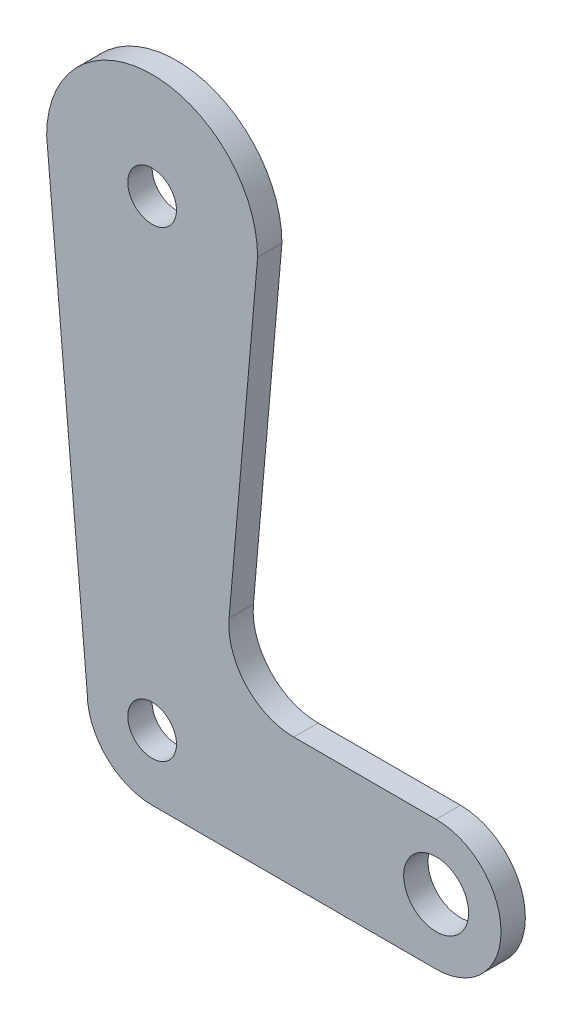
ISO-10303-21;
HEADER;
FILE_DESCRIPTION(('STEP AP214'),'2;1');
FILE_NAME('part.step','',(''),(''),'','','');
FILE_SCHEMA(('AUTOMOTIVE_DESIGN { 1 0 10303 214 1 1 1 1 }'));
ENDSEC;
DATA;
#1=APPLICATION_CONTEXT('core data for automotive mechanical design processes');
#2=APPLICATION_PROTOCOL_DEFINITION('international standard','automotive_design',2000,#1);
#3=PRODUCT_CONTEXT('',#1,'mechanical');
#4=PRODUCT('Part','Part','',(#3));
#5=PRODUCT_RELATED_PRODUCT_CATEGORY('part','',(#4));
#6=PRODUCT_DEFINITION_FORMATION('','',#4);
#7=PRODUCT_DEFINITION_CONTEXT('part definition',#1,'design');
#8=PRODUCT_DEFINITION('design','',#6,#7);
#9=PRODUCT_DEFINITION_SHAPE('','',#8);
#10=(LENGTH_UNIT() NAMED_UNIT(*) SI_UNIT(.MILLI.,.METRE.));
#11=(NAMED_UNIT(*) PLANE_ANGLE_UNIT() SI_UNIT($,.RADIAN.));
#12=(NAMED_UNIT(*) SI_UNIT($,.STERADIAN.) SOLID_ANGLE_UNIT());
#13=UNCERTAINTY_MEASURE_WITH_UNIT(LENGTH_MEASURE(1.E-05),#10,'distance_accuracy_value','');
#14=(GEOMETRIC_REPRESENTATION_CONTEXT(3) GLOBAL_UNCERTAINTY_ASSIGNED_CONTEXT((#13)) GLOBAL_UNIT_ASSIGNED_CONTEXT((#10,
#11,#12)) REPRESENTATION_CONTEXT('',''));
#15=CARTESIAN_POINT('',(0.,0.,0.));
#16=DIRECTION('',(0.,0.,1.));
#17=DIRECTION('',(1.,0.,0.));
#18=AXIS2_PLACEMENT_3D('',#15,#16,#17);
#19=CARTESIAN_POINT('',(35.,0.,-3.));
#20=DIRECTION('',(0.,0.,1.));
#21=DIRECTION('',(1.,0.,0.));
#22=AXIS2_PLACEMENT_3D('',#19,#20,#21);
#23=CYLINDRICAL_SURFACE('',#22,8.);
#24=CARTESIAN_POINT('',(35.,0.,0.));
#25=DIRECTION('',(0.,0.,1.));
#26=DIRECTION('',(1.,0.,0.));
#27=AXIS2_PLACEMENT_3D('',#24,#25,#26);
#28=CIRCLE('',#27,8.);
#29=CARTESIAN_POINT('',(35.,-8.,0.));
#30=VERTEX_POINT('',#29);
#31=CARTESIAN_POINT('',(35.,8.,0.));
#32=VERTEX_POINT('',#31);
#33=EDGE_CURVE('E135',#30,#32,#28,.T.);
#34=ORIENTED_EDGE('',*,*,#33,.F.);
#35=DIRECTION('',(0.,0.,1.));
#36=VECTOR('',#35,1.);
#37=CARTESIAN_POINT('',(35.,-8.,-3.));
#38=LINE('',#37,#36);
#39=CARTESIAN_POINT('',(35.,-8.,-3.));
#40=VERTEX_POINT('',#39);
#41=EDGE_CURVE('E11',#40,#30,#38,.T.);
#42=ORIENTED_EDGE('',*,*,#41,.F.);
#43=CARTESIAN_POINT('',(35.,0.,-3.));
#44=DIRECTION('',(0.,0.,1.));
#45=DIRECTION('',(1.,0.,0.));
#46=AXIS2_PLACEMENT_3D('',#43,#44,#45);
#47=CIRCLE('',#46,8.);
#48=CARTESIAN_POINT('',(35.,8.,-3.));
#49=VERTEX_POINT('',#48);
#50=EDGE_CURVE('E156',#40,#49,#47,.T.);
#51=ORIENTED_EDGE('',*,*,#50,.T.);
#52=DIRECTION('',(0.,0.,1.));
#53=VECTOR('',#52,1.);
#54=CARTESIAN_POINT('',(35.,8.,-3.));
#55=LINE('',#54,#53);
#56=EDGE_CURVE('E41',#49,#32,#55,.T.);
#57=ORIENTED_EDGE('',*,*,#56,.T.);
#58=EDGE_LOOP('',(#34,#42,#51,#57));
#59=FACE_BOUND('',#58,.T.);
#60=ADVANCED_FACE('F38',(#59),#23,.T.);
#61=CARTESIAN_POINT('',(35.,-8.,-3.));
#62=DIRECTION('',(0.,-1.,0.));
#63=DIRECTION('',(1.,0.,0.));
#64=AXIS2_PLACEMENT_3D('',#61,#62,#63);
#65=PLANE('',#64);
#66=DIRECTION('',(1.,0.,0.));
#67=VECTOR('',#66,1.);
#68=CARTESIAN_POINT('',(35.,-8.,0.));
#69=LINE('',#68,#67);
#70=CARTESIAN_POINT('',(0.,-8.,0.));
#71=VERTEX_POINT('',#70);
#72=EDGE_CURVE('E154',#71,#30,#69,.T.);
#73=ORIENTED_EDGE('',*,*,#72,.F.);
#74=DIRECTION('',(0.,0.,1.));
#75=VECTOR('',#74,1.);
#76=CARTESIAN_POINT('',(0.,-8.,-3.));
#77=LINE('',#76,#75);
#78=CARTESIAN_POINT('',(0.,-8.,-3.));
#79=VERTEX_POINT('',#78);
#80=EDGE_CURVE('E47',#79,#71,#77,.T.);
#81=ORIENTED_EDGE('',*,*,#80,.F.);
#82=DIRECTION('',(1.,0.,0.));
#83=VECTOR('',#82,1.);
#84=CARTESIAN_POINT('',(35.,-8.,-3.));
#85=LINE('',#84,#83);
#86=EDGE_CURVE('E125',#79,#40,#85,.T.);
#87=ORIENTED_EDGE('',*,*,#86,.T.);
#88=ORIENTED_EDGE('',*,*,#41,.T.);
#89=EDGE_LOOP('',(#73,#81,#87,#88));
#90=FACE_BOUND('',#89,.T.);
#91=ADVANCED_FACE('F168',(#90),#65,.T.);
#92=CARTESIAN_POINT('',(0.,0.,-3.));
#93=DIRECTION('',(0.,0.,1.));
#94=DIRECTION('',(1.,0.,0.));
#95=AXIS2_PLACEMENT_3D('',#92,#93,#94);
#96=CYLINDRICAL_SURFACE('',#95,8.);
#97=CARTESIAN_POINT('',(0.,0.,0.));
#98=DIRECTION('',(0.,0.,1.));
#99=DIRECTION('',(1.,0.,0.));
#100=AXIS2_PLACEMENT_3D('',#97,#98,#99);
#101=CIRCLE('',#100,8.);
#102=CARTESIAN_POINT('',(-8.,0.,0.));
#103=VERTEX_POINT('',#102);
#104=EDGE_CURVE('E112',#103,#71,#101,.T.);
#105=ORIENTED_EDGE('',*,*,#104,.F.);
#106=DIRECTION('',(0.,0.,1.));
#107=VECTOR('',#106,1.);
#108=CARTESIAN_POINT('',(-8.,0.,-3.));
#109=LINE('',#108,#107);
#110=CARTESIAN_POINT('',(-8.,0.,-3.));
#111=VERTEX_POINT('',#110);
#112=EDGE_CURVE('E107',#111,#103,#109,.T.);
#113=ORIENTED_EDGE('',*,*,#112,.F.);
#114=CARTESIAN_POINT('',(0.,0.,-3.));
#115=DIRECTION('',(0.,0.,1.));
#116=DIRECTION('',(1.,0.,0.));
#117=AXIS2_PLACEMENT_3D('',#114,#115,#116);
#118=CIRCLE('',#117,8.);
#119=EDGE_CURVE('E110',#111,#79,#118,.T.);
#120=ORIENTED_EDGE('',*,*,#119,.T.);
#121=ORIENTED_EDGE('',*,*,#80,.T.);
#122=EDGE_LOOP('',(#105,#113,#120,#121));
#123=FACE_BOUND('',#122,.T.);
#124=ADVANCED_FACE('F109',(#123),#96,.T.);
#125=CARTESIAN_POINT('',(-13.,57.,-3.));
#126=DIRECTION('',(-0.996174723949222,-0.0873837477148439,0.));
#127=DIRECTION('',(0.087383747714844,-0.996174723949222,0.));
#128=AXIS2_PLACEMENT_3D('',#125,#126,#127);
#129=PLANE('',#128);
#130=DIRECTION('',(0.087383747714844,-0.996174723949222,0.));
#131=VECTOR('',#130,1.);
#132=CARTESIAN_POINT('',(-13.,57.,0.));
#133=LINE('',#132,#131);
#134=CARTESIAN_POINT('',(-13.,57.,0.));
#135=VERTEX_POINT('',#134);
#136=EDGE_CURVE('E151',#135,#103,#133,.T.);
#137=ORIENTED_EDGE('',*,*,#136,.F.);
#138=DIRECTION('',(0.,0.,1.));
#139=VECTOR('',#138,1.);
#140=CARTESIAN_POINT('',(-13.,57.,-3.));
#141=LINE('',#140,#139);
#142=CARTESIAN_POINT('',(-13.,57.,-3.));
#143=VERTEX_POINT('',#142);
#144=EDGE_CURVE('E117',#143,#135,#141,.T.);
#145=ORIENTED_EDGE('',*,*,#144,.F.);
#146=DIRECTION('',(0.087383747714844,-0.996174723949222,0.));
#147=VECTOR('',#146,1.);
#148=CARTESIAN_POINT('',(-13.,57.,-3.));
#149=LINE('',#148,#147);
#150=EDGE_CURVE('E123',#143,#111,#149,.T.);
#151=ORIENTED_EDGE('',*,*,#150,.T.);
#152=ORIENTED_EDGE('',*,*,#112,.T.);
#153=EDGE_LOOP('',(#137,#145,#151,#152));
#154=FACE_BOUND('',#153,.T.);
#155=ADVANCED_FACE('F127',(#154),#129,.T.);
#156=CARTESIAN_POINT('',(0.,57.,-3.));
#157=DIRECTION('',(0.,0.,1.));
#158=DIRECTION('',(1.,0.,0.));
#159=AXIS2_PLACEMENT_3D('',#156,#157,#158);
#160=CYLINDRICAL_SURFACE('',#159,13.);
#161=CARTESIAN_POINT('',(0.,57.,0.));
#162=DIRECTION('',(0.,0.,1.));
#163=DIRECTION('',(1.,0.,0.));
#164=AXIS2_PLACEMENT_3D('',#161,#162,#163);
#165=CIRCLE('',#164,13.);
#166=CARTESIAN_POINT('',(13.,57.,0.));
#167=VERTEX_POINT('',#166);
#168=EDGE_CURVE('E148',#167,#135,#165,.T.);
#169=ORIENTED_EDGE('',*,*,#168,.F.);
#170=DIRECTION('',(0.,0.,1.));
#171=VECTOR('',#170,1.);
#172=CARTESIAN_POINT('',(13.,57.,-3.));
#173=LINE('',#172,#171);
#174=CARTESIAN_POINT('',(13.,57.,-3.));
#175=VERTEX_POINT('',#174);
#176=EDGE_CURVE('E160',#175,#167,#173,.T.);
#177=ORIENTED_EDGE('',*,*,#176,.F.);
#178=CARTESIAN_POINT('',(0.,57.,-3.));
#179=DIRECTION('',(0.,0.,1.));
#180=DIRECTION('',(1.,0.,0.));
#181=AXIS2_PLACEMENT_3D('',#178,#179,#180);
#182=CIRCLE('',#181,13.);
#183=EDGE_CURVE('E128',#175,#143,#182,.T.);
#184=ORIENTED_EDGE('',*,*,#183,.T.);
#185=ORIENTED_EDGE('',*,*,#144,.T.);
#186=EDGE_LOOP('',(#169,#177,#184,#185));
#187=FACE_BOUND('',#186,.T.);
#188=ADVANCED_FACE('F181',(#187),#160,.T.);
#189=CARTESIAN_POINT('',(13.,57.,-3.));
#190=DIRECTION('',(0.996214620048379,-0.086927733214799,0.));
#191=DIRECTION('',(0.0869277332147991,0.996214620048379,0.));
#192=AXIS2_PLACEMENT_3D('',#189,#190,#191);
#193=PLANE('',#192);
#194=DIRECTION('',(0.086927733214799,0.996214620048379,0.));
#195=VECTOR('',#194,1.);
#196=CARTESIAN_POINT('',(13.,57.,0.));
#197=LINE('',#196,#195);
#198=CARTESIAN_POINT('',(9.48310158786697,16.6954218657184,0.));
#199=VERTEX_POINT('',#198);
#200=EDGE_CURVE('E145',#199,#167,#197,.T.);
#201=ORIENTED_EDGE('',*,*,#200,.F.);
#202=DIRECTION('',(0.,0.,1.));
#203=VECTOR('',#202,1.);
#204=CARTESIAN_POINT('',(9.48310158786697,16.6954218657184,-3.));
#205=LINE('',#204,#203);
#206=CARTESIAN_POINT('',(9.48310158786697,16.6954218657184,-3.));
#207=VERTEX_POINT('',#206);
#208=EDGE_CURVE('E162',#207,#199,#205,.T.);
#209=ORIENTED_EDGE('',*,*,#208,.F.);
#210=DIRECTION('',(0.086927733214799,0.996214620048379,0.));
#211=VECTOR('',#210,1.);
#212=CARTESIAN_POINT('',(13.,57.,-3.));
#213=LINE('',#212,#211);
#214=EDGE_CURVE('E130',#207,#175,#213,.T.);
#215=ORIENTED_EDGE('',*,*,#214,.T.);
#216=ORIENTED_EDGE('',*,*,#176,.T.);
#217=EDGE_LOOP('',(#201,#209,#215,#216));
#218=FACE_BOUND('',#217,.T.);
#219=ADVANCED_FACE('F184',(#218),#193,.T.);
#220=CARTESIAN_POINT('',(17.452818548254,16.,-3.));
#221=DIRECTION('',(0.,0.,1.));
#222=DIRECTION('',(1.,0.,0.));
#223=AXIS2_PLACEMENT_3D('',#220,#221,#222);
#224=CYLINDRICAL_SURFACE('',#223,8.);
#225=CARTESIAN_POINT('',(17.452818548254,16.,0.));
#226=DIRECTION('',(0.,0.,-1.));
#227=DIRECTION('',(1.,0.,0.));
#228=AXIS2_PLACEMENT_3D('',#225,#226,#227);
#229=CIRCLE('',#228,8.);
#230=CARTESIAN_POINT('',(17.452818548254,8.,0.));
#231=VERTEX_POINT('',#230);
#232=EDGE_CURVE('E142',#231,#199,#229,.T.);
#233=ORIENTED_EDGE('',*,*,#232,.F.);
#234=DIRECTION('',(0.,0.,1.));
#235=VECTOR('',#234,1.);
#236=CARTESIAN_POINT('',(17.452818548254,8.,-3.));
#237=LINE('',#236,#235);
#238=CARTESIAN_POINT('',(17.452818548254,8.,-3.));
#239=VERTEX_POINT('',#238);
#240=EDGE_CURVE('E163',#239,#231,#237,.T.);
#241=ORIENTED_EDGE('',*,*,#240,.F.);
#242=CARTESIAN_POINT('',(17.452818548254,16.,-3.));
#243=DIRECTION('',(0.,0.,-1.));
#244=DIRECTION('',(1.,0.,0.));
#245=AXIS2_PLACEMENT_3D('',#242,#243,#244);
#246=CIRCLE('',#245,8.);
#247=EDGE_CURVE('E240',#239,#207,#246,.T.);
#248=ORIENTED_EDGE('',*,*,#247,.T.);
#249=ORIENTED_EDGE('',*,*,#208,.T.);
#250=EDGE_LOOP('',(#233,#241,#248,#249));
#251=FACE_BOUND('',#250,.T.);
#252=ADVANCED_FACE('F188',(#251),#224,.F.);
#253=CARTESIAN_POINT('',(35.,8.,-3.));
#254=DIRECTION('',(0.,1.,0.));
#255=DIRECTION('',(-1.,0.,0.));
#256=AXIS2_PLACEMENT_3D('',#253,#254,#255);
#257=PLANE('',#256);
#258=DIRECTION('',(-1.,0.,0.));
#259=VECTOR('',#258,1.);
#260=CARTESIAN_POINT('',(35.,8.,0.));
#261=LINE('',#260,#259);
#262=EDGE_CURVE('E138',#32,#231,#261,.T.);
#263=ORIENTED_EDGE('',*,*,#262,.F.);
#264=ORIENTED_EDGE('',*,*,#56,.F.);
#265=DIRECTION('',(-1.,0.,0.));
#266=VECTOR('',#265,1.);
#267=CARTESIAN_POINT('',(35.,8.,-3.));
#268=LINE('',#267,#266);
#269=EDGE_CURVE('E238',#49,#239,#268,.T.);
#270=ORIENTED_EDGE('',*,*,#269,.T.);
#271=ORIENTED_EDGE('',*,*,#240,.T.);
#272=EDGE_LOOP('',(#263,#264,#270,#271));
#273=FACE_BOUND('',#272,.T.);
#274=ADVANCED_FACE('F165',(#273),#257,.T.);
#275=CARTESIAN_POINT('',(35.,0.,-3.));
#276=DIRECTION('',(0.,0.,1.));
#277=DIRECTION('',(1.,0.,0.));
#278=AXIS2_PLACEMENT_3D('',#275,#276,#277);
#279=PLANE('',#278);
#280=CARTESIAN_POINT('',(0.,57.,-3.));
#281=DIRECTION('',(0.,0.,1.));
#282=DIRECTION('',(1.,0.,0.));
#283=AXIS2_PLACEMENT_3D('',#280,#281,#282);
#284=CIRCLE('',#283,3.);
#285=CARTESIAN_POINT('',(3.,57.,-3.));
#286=VERTEX_POINT('',#285);
#287=EDGE_CURVE('E219',#286,#286,#284,.T.);
#288=ORIENTED_EDGE('',*,*,#287,.T.);
#289=EDGE_LOOP('',(#288));
#290=FACE_BOUND('',#289,.T.);
#291=CARTESIAN_POINT('',(0.,0.,-3.));
#292=DIRECTION('',(0.,0.,1.));
#293=DIRECTION('',(1.,0.,0.));
#294=AXIS2_PLACEMENT_3D('',#291,#292,#293);
#295=CIRCLE('',#294,3.);
#296=CARTESIAN_POINT('',(3.,0.,-3.));
#297=VERTEX_POINT('',#296);
#298=EDGE_CURVE('E227',#297,#297,#295,.T.);
#299=ORIENTED_EDGE('',*,*,#298,.T.);
#300=EDGE_LOOP('',(#299));
#301=FACE_BOUND('',#300,.T.);
#302=CARTESIAN_POINT('',(35.,0.,-3.));
#303=DIRECTION('',(0.,0.,1.));
#304=DIRECTION('',(1.,0.,0.));
#305=AXIS2_PLACEMENT_3D('',#302,#303,#304);
#306=CIRCLE('',#305,4.);
#307=CARTESIAN_POINT('',(39.,0.,-3.));
#308=VERTEX_POINT('',#307);
#309=EDGE_CURVE('E139',#308,#308,#306,.T.);
#310=ORIENTED_EDGE('',*,*,#309,.T.);
#311=EDGE_LOOP('',(#310));
#312=FACE_BOUND('',#311,.T.);
#313=ORIENTED_EDGE('',*,*,#50,.F.);
#314=ORIENTED_EDGE('',*,*,#86,.F.);
#315=ORIENTED_EDGE('',*,*,#119,.F.);
#316=ORIENTED_EDGE('',*,*,#150,.F.);
#317=ORIENTED_EDGE('',*,*,#183,.F.);
#318=ORIENTED_EDGE('',*,*,#214,.F.);
#319=ORIENTED_EDGE('',*,*,#247,.F.);
#320=ORIENTED_EDGE('',*,*,#269,.F.);
#321=EDGE_LOOP('',(#313,#314,#315,#316,#317,#318,#319,#320));
#322=FACE_BOUND('',#321,.T.);
#323=ADVANCED_FACE('F121',(#290,#301,#312,#322),#279,.F.);
#324=CARTESIAN_POINT('',(35.,0.,0.));
#325=DIRECTION('',(0.,0.,1.));
#326=DIRECTION('',(1.,0.,0.));
#327=AXIS2_PLACEMENT_3D('',#324,#325,#326);
#328=PLANE('',#327);
#329=CARTESIAN_POINT('',(0.,57.,0.));
#330=DIRECTION('',(0.,0.,1.));
#331=DIRECTION('',(1.,0.,0.));
#332=AXIS2_PLACEMENT_3D('',#329,#330,#331);
#333=CIRCLE('',#332,3.);
#334=CARTESIAN_POINT('',(3.,57.,0.));
#335=VERTEX_POINT('',#334);
#336=EDGE_CURVE('E222',#335,#335,#333,.T.);
#337=ORIENTED_EDGE('',*,*,#336,.F.);
#338=EDGE_LOOP('',(#337));
#339=FACE_BOUND('',#338,.T.);
#340=CARTESIAN_POINT('',(0.,0.,0.));
#341=DIRECTION('',(0.,0.,1.));
#342=DIRECTION('',(1.,0.,0.));
#343=AXIS2_PLACEMENT_3D('',#340,#341,#342);
#344=CIRCLE('',#343,3.);
#345=CARTESIAN_POINT('',(3.,0.,0.));
#346=VERTEX_POINT('',#345);
#347=EDGE_CURVE('E224',#346,#346,#344,.T.);
#348=ORIENTED_EDGE('',*,*,#347,.F.);
#349=EDGE_LOOP('',(#348));
#350=FACE_BOUND('',#349,.T.);
#351=CARTESIAN_POINT('',(35.,0.,0.));
#352=DIRECTION('',(0.,0.,1.));
#353=DIRECTION('',(1.,0.,0.));
#354=AXIS2_PLACEMENT_3D('',#351,#352,#353);
#355=CIRCLE('',#354,4.);
#356=CARTESIAN_POINT('',(39.,0.,0.));
#357=VERTEX_POINT('',#356);
#358=EDGE_CURVE('E230',#357,#357,#355,.T.);
#359=ORIENTED_EDGE('',*,*,#358,.F.);
#360=EDGE_LOOP('',(#359));
#361=FACE_BOUND('',#360,.T.);
#362=ORIENTED_EDGE('',*,*,#33,.T.);
#363=ORIENTED_EDGE('',*,*,#262,.T.);
#364=ORIENTED_EDGE('',*,*,#232,.T.);
#365=ORIENTED_EDGE('',*,*,#200,.T.);
#366=ORIENTED_EDGE('',*,*,#168,.T.);
#367=ORIENTED_EDGE('',*,*,#136,.T.);
#368=ORIENTED_EDGE('',*,*,#104,.T.);
#369=ORIENTED_EDGE('',*,*,#72,.T.);
#370=EDGE_LOOP('',(#362,#363,#364,#365,#366,#367,#368,#369));
#371=FACE_BOUND('',#370,.T.);
#372=ADVANCED_FACE('F167',(#339,#350,#361,#371),#328,.T.);
#373=CARTESIAN_POINT('',(35.,0.,-3.));
#374=DIRECTION('',(0.,0.,1.));
#375=DIRECTION('',(1.,0.,0.));
#376=AXIS2_PLACEMENT_3D('',#373,#374,#375);
#377=CYLINDRICAL_SURFACE('',#376,4.);
#378=ORIENTED_EDGE('',*,*,#309,.F.);
#379=EDGE_LOOP('',(#378));
#380=FACE_BOUND('',#379,.T.);
#381=ORIENTED_EDGE('',*,*,#358,.T.);
#382=EDGE_LOOP('',(#381));
#383=FACE_BOUND('',#382,.T.);
#384=ADVANCED_FACE('F200',(#380,#383),#377,.F.);
#385=CARTESIAN_POINT('',(0.,0.,-3.));
#386=DIRECTION('',(0.,0.,1.));
#387=DIRECTION('',(1.,0.,0.));
#388=AXIS2_PLACEMENT_3D('',#385,#386,#387);
#389=CYLINDRICAL_SURFACE('',#388,3.);
#390=ORIENTED_EDGE('',*,*,#298,.F.);
#391=EDGE_LOOP('',(#390));
#392=FACE_BOUND('',#391,.T.);
#393=ORIENTED_EDGE('',*,*,#347,.T.);
#394=EDGE_LOOP('',(#393));
#395=FACE_BOUND('',#394,.T.);
#396=ADVANCED_FACE('F207',(#392,#395),#389,.F.);
#397=CARTESIAN_POINT('',(0.,57.,-3.));
#398=DIRECTION('',(0.,0.,1.));
#399=DIRECTION('',(1.,0.,0.));
#400=AXIS2_PLACEMENT_3D('',#397,#398,#399);
#401=CYLINDRICAL_SURFACE('',#400,3.);
#402=ORIENTED_EDGE('',*,*,#287,.F.);
#403=EDGE_LOOP('',(#402));
#404=FACE_BOUND('',#403,.T.);
#405=ORIENTED_EDGE('',*,*,#336,.T.);
#406=EDGE_LOOP('',(#405));
#407=FACE_BOUND('',#406,.T.);
#408=ADVANCED_FACE('F211',(#404,#407),#401,.F.);
#409=CLOSED_SHELL('',(#60,#91,#124,#155,#188,#219,#252,#274,#323,#372,#384,#396,#408));
#410=MANIFOLD_SOLID_BREP('B2',#409);
#411=ADVANCED_BREP_SHAPE_REPRESENTATION('',(#18,#410),#14);
#412=SHAPE_DEFINITION_REPRESENTATION(#9,#411);
ENDSEC;
END-ISO-10303-21;
